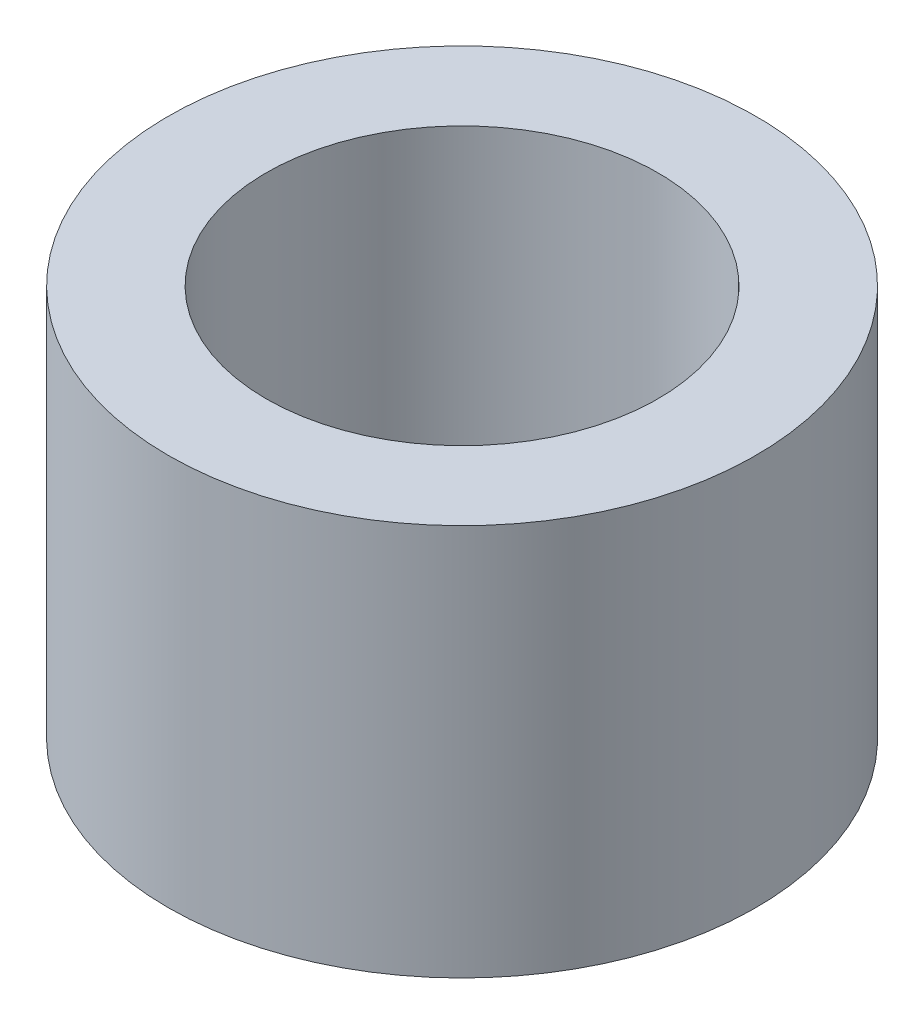
ISO-10303-21;
HEADER;
FILE_DESCRIPTION(('STEP AP214'),'2;1');
FILE_NAME('part.step','',(''),(''),'','','');
FILE_SCHEMA(('AUTOMOTIVE_DESIGN { 1 0 10303 214 1 1 1 1 }'));
ENDSEC;
DATA;
#1=APPLICATION_CONTEXT('core data for automotive mechanical design processes');
#2=APPLICATION_PROTOCOL_DEFINITION('international standard','automotive_design',2000,#1);
#3=PRODUCT_CONTEXT('',#1,'mechanical');
#4=PRODUCT('Part','Part','',(#3));
#5=PRODUCT_RELATED_PRODUCT_CATEGORY('part','',(#4));
#6=PRODUCT_DEFINITION_FORMATION('','',#4);
#7=PRODUCT_DEFINITION_CONTEXT('part definition',#1,'design');
#8=PRODUCT_DEFINITION('design','',#6,#7);
#9=PRODUCT_DEFINITION_SHAPE('','',#8);
#10=(LENGTH_UNIT() NAMED_UNIT(*) SI_UNIT(.MILLI.,.METRE.));
#11=(NAMED_UNIT(*) PLANE_ANGLE_UNIT() SI_UNIT($,.RADIAN.));
#12=(NAMED_UNIT(*) SI_UNIT($,.STERADIAN.) SOLID_ANGLE_UNIT());
#13=UNCERTAINTY_MEASURE_WITH_UNIT(LENGTH_MEASURE(1.E-05),#10,'distance_accuracy_value','');
#14=(GEOMETRIC_REPRESENTATION_CONTEXT(3) GLOBAL_UNCERTAINTY_ASSIGNED_CONTEXT((#13)) GLOBAL_UNIT_ASSIGNED_CONTEXT((#10,
#11,#12)) REPRESENTATION_CONTEXT('',''));
#15=CARTESIAN_POINT('',(0.,0.,0.));
#16=DIRECTION('',(0.,0.,1.));
#17=DIRECTION('',(1.,0.,0.));
#18=AXIS2_PLACEMENT_3D('',#15,#16,#17);
#19=CARTESIAN_POINT('',(0.,6.35,0.));
#20=DIRECTION('',(0.,1.,0.));
#21=DIRECTION('',(0.,0.,1.));
#22=AXIS2_PLACEMENT_3D('',#19,#20,#21);
#23=PLANE('',#22);
#24=CARTESIAN_POINT('',(0.,6.35,0.));
#25=DIRECTION('',(0.,1.,0.));
#26=DIRECTION('',(0.,0.,1.));
#27=AXIS2_PLACEMENT_3D('',#24,#25,#26);
#28=CIRCLE('',#27,4.7625);
#29=CARTESIAN_POINT('',(0.,6.35,4.7625));
#30=VERTEX_POINT('',#29);
#31=EDGE_CURVE('E10',#30,#30,#28,.T.);
#32=ORIENTED_EDGE('',*,*,#31,.T.);
#33=EDGE_LOOP('',(#32));
#34=FACE_BOUND('',#33,.T.);
#35=CARTESIAN_POINT('',(0.,6.35,0.));
#36=DIRECTION('',(0.,1.,0.));
#37=DIRECTION('',(0.,0.,1.));
#38=AXIS2_PLACEMENT_3D('',#35,#36,#37);
#39=CIRCLE('',#38,3.175);
#40=CARTESIAN_POINT('',(0.,6.35,3.175));
#41=VERTEX_POINT('',#40);
#42=EDGE_CURVE('E48',#41,#41,#39,.T.);
#43=ORIENTED_EDGE('',*,*,#42,.F.);
#44=EDGE_LOOP('',(#43));
#45=FACE_BOUND('',#44,.T.);
#46=ADVANCED_FACE('F37',(#34,#45),#23,.T.);
#47=CARTESIAN_POINT('',(0.,0.,0.));
#48=DIRECTION('',(0.,1.,0.));
#49=DIRECTION('',(0.,0.,1.));
#50=AXIS2_PLACEMENT_3D('',#47,#48,#49);
#51=PLANE('',#50);
#52=CARTESIAN_POINT('',(0.,0.,0.));
#53=DIRECTION('',(0.,1.,0.));
#54=DIRECTION('',(0.,0.,1.));
#55=AXIS2_PLACEMENT_3D('',#52,#53,#54);
#56=CIRCLE('',#55,4.7625);
#57=CARTESIAN_POINT('',(0.,0.,4.7625));
#58=VERTEX_POINT('',#57);
#59=EDGE_CURVE('E41',#58,#58,#56,.T.);
#60=ORIENTED_EDGE('',*,*,#59,.F.);
#61=EDGE_LOOP('',(#60));
#62=FACE_BOUND('',#61,.T.);
#63=CARTESIAN_POINT('',(0.,0.,0.));
#64=DIRECTION('',(0.,1.,0.));
#65=DIRECTION('',(0.,0.,1.));
#66=AXIS2_PLACEMENT_3D('',#63,#64,#65);
#67=CIRCLE('',#66,3.175);
#68=CARTESIAN_POINT('',(0.,0.,3.175));
#69=VERTEX_POINT('',#68);
#70=EDGE_CURVE('E50',#69,#69,#67,.T.);
#71=ORIENTED_EDGE('',*,*,#70,.T.);
#72=EDGE_LOOP('',(#71));
#73=FACE_BOUND('',#72,.T.);
#74=ADVANCED_FACE('F60',(#62,#73),#51,.F.);
#75=CARTESIAN_POINT('',(0.,6.35,0.));
#76=DIRECTION('',(0.,-1.,0.));
#77=DIRECTION('',(0.,0.,-1.));
#78=AXIS2_PLACEMENT_3D('',#75,#76,#77);
#79=CYLINDRICAL_SURFACE('',#78,4.7625);
#80=ORIENTED_EDGE('',*,*,#31,.F.);
#81=EDGE_LOOP('',(#80));
#82=FACE_BOUND('',#81,.T.);
#83=ORIENTED_EDGE('',*,*,#59,.T.);
#84=EDGE_LOOP('',(#83));
#85=FACE_BOUND('',#84,.T.);
#86=ADVANCED_FACE('F39',(#82,#85),#79,.T.);
#87=CARTESIAN_POINT('',(0.,6.35,0.));
#88=DIRECTION('',(0.,-1.,0.));
#89=DIRECTION('',(0.,0.,-1.));
#90=AXIS2_PLACEMENT_3D('',#87,#88,#89);
#91=CYLINDRICAL_SURFACE('',#90,3.175);
#92=ORIENTED_EDGE('',*,*,#42,.T.);
#93=EDGE_LOOP('',(#92));
#94=FACE_BOUND('',#93,.T.);
#95=ORIENTED_EDGE('',*,*,#70,.F.);
#96=EDGE_LOOP('',(#95));
#97=FACE_BOUND('',#96,.T.);
#98=ADVANCED_FACE('F56',(#94,#97),#91,.F.);
#99=CLOSED_SHELL('',(#46,#74,#86,#98));
#100=MANIFOLD_SOLID_BREP('B2',#99);
#101=ADVANCED_BREP_SHAPE_REPRESENTATION('',(#18,#100),#14);
#102=SHAPE_DEFINITION_REPRESENTATION(#9,#101);
ENDSEC;
END-ISO-10303-21;
